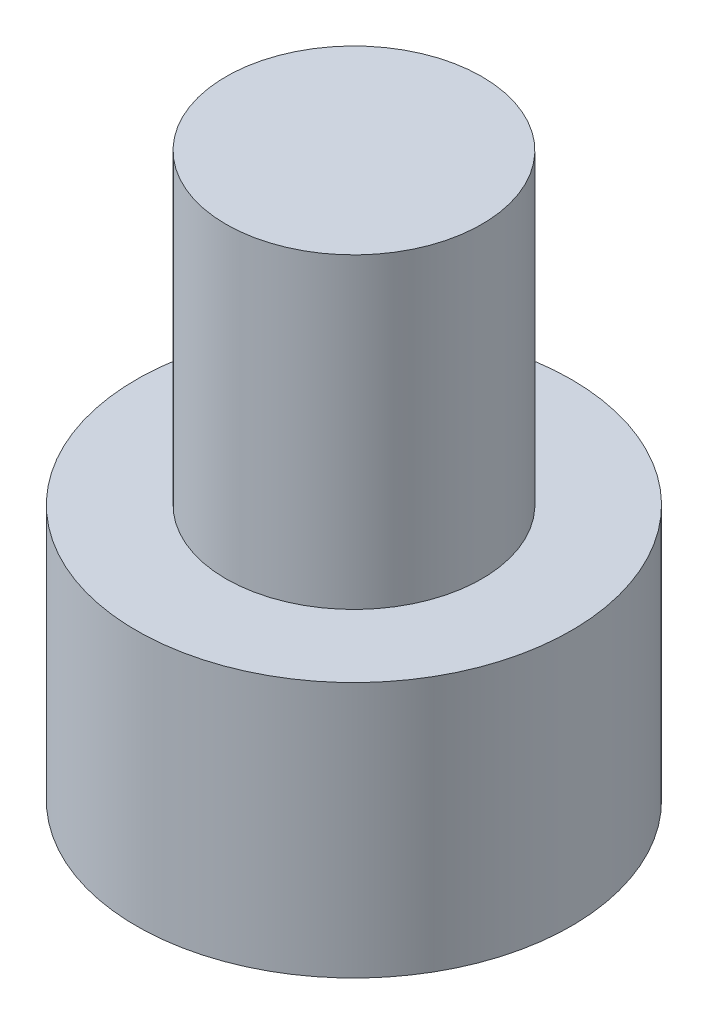
ISO-10303-21;
HEADER;
FILE_DESCRIPTION(('STEP AP214'),'2;1');
FILE_NAME('part.step','',(''),(''),'','','');
FILE_SCHEMA(('AUTOMOTIVE_DESIGN { 1 0 10303 214 1 1 1 1 }'));
ENDSEC;
DATA;
#1=APPLICATION_CONTEXT('core data for automotive mechanical design processes');
#2=APPLICATION_PROTOCOL_DEFINITION('international standard','automotive_design',2000,#1);
#3=PRODUCT_CONTEXT('',#1,'mechanical');
#4=PRODUCT('Part','Part','',(#3));
#5=PRODUCT_RELATED_PRODUCT_CATEGORY('part','',(#4));
#6=PRODUCT_DEFINITION_FORMATION('','',#4);
#7=PRODUCT_DEFINITION_CONTEXT('part definition',#1,'design');
#8=PRODUCT_DEFINITION('design','',#6,#7);
#9=PRODUCT_DEFINITION_SHAPE('','',#8);
#10=(LENGTH_UNIT() NAMED_UNIT(*) SI_UNIT(.MILLI.,.METRE.));
#11=(NAMED_UNIT(*) PLANE_ANGLE_UNIT() SI_UNIT($,.RADIAN.));
#12=(NAMED_UNIT(*) SI_UNIT($,.STERADIAN.) SOLID_ANGLE_UNIT());
#13=UNCERTAINTY_MEASURE_WITH_UNIT(LENGTH_MEASURE(1.E-05),#10,'distance_accuracy_value','');
#14=(GEOMETRIC_REPRESENTATION_CONTEXT(3) GLOBAL_UNCERTAINTY_ASSIGNED_CONTEXT((#13)) GLOBAL_UNIT_ASSIGNED_CONTEXT((#10,
#11,#12)) REPRESENTATION_CONTEXT('',''));
#15=CARTESIAN_POINT('',(0.,0.,0.));
#16=DIRECTION('',(0.,0.,1.));
#17=DIRECTION('',(1.,0.,0.));
#18=AXIS2_PLACEMENT_3D('',#15,#16,#17);
#19=CARTESIAN_POINT('',(0.,6.,0.));
#20=DIRECTION('',(0.,-1.,0.));
#21=DIRECTION('',(0.,0.,-1.));
#22=AXIS2_PLACEMENT_3D('',#19,#20,#21);
#23=CYLINDRICAL_SURFACE('',#22,2.5);
#24=CARTESIAN_POINT('',(0.,6.,0.));
#25=DIRECTION('',(0.,1.,0.));
#26=DIRECTION('',(0.,0.,1.));
#27=AXIS2_PLACEMENT_3D('',#24,#25,#26);
#28=CIRCLE('',#27,2.5);
#29=CARTESIAN_POINT('',(0.,6.,2.5));
#30=VERTEX_POINT('',#29);
#31=EDGE_CURVE('E11',#30,#30,#28,.T.);
#32=ORIENTED_EDGE('',*,*,#31,.F.);
#33=EDGE_LOOP('',(#32));
#34=FACE_BOUND('',#33,.T.);
#35=CARTESIAN_POINT('',(0.,0.,0.));
#36=DIRECTION('',(0.,1.,0.));
#37=DIRECTION('',(0.,0.,1.));
#38=AXIS2_PLACEMENT_3D('',#35,#36,#37);
#39=CIRCLE('',#38,2.5);
#40=CARTESIAN_POINT('',(0.,0.,2.5));
#41=VERTEX_POINT('',#40);
#42=EDGE_CURVE('E42',#41,#41,#39,.T.);
#43=ORIENTED_EDGE('',*,*,#42,.T.);
#44=EDGE_LOOP('',(#43));
#45=FACE_BOUND('',#44,.T.);
#46=ADVANCED_FACE('F39',(#34,#45),#23,.T.);
#47=CARTESIAN_POINT('',(0.,6.,0.));
#48=DIRECTION('',(0.,1.,0.));
#49=DIRECTION('',(0.,0.,1.));
#50=AXIS2_PLACEMENT_3D('',#47,#48,#49);
#51=PLANE('',#50);
#52=ORIENTED_EDGE('',*,*,#31,.T.);
#53=EDGE_LOOP('',(#52));
#54=FACE_BOUND('',#53,.T.);
#55=ADVANCED_FACE('F172',(#54),#51,.T.);
#56=CARTESIAN_POINT('',(0.,-5.,0.));
#57=DIRECTION('',(0.,1.,0.));
#58=DIRECTION('',(0.,0.,1.));
#59=AXIS2_PLACEMENT_3D('',#56,#57,#58);
#60=CYLINDRICAL_SURFACE('',#59,4.25);
#61=CARTESIAN_POINT('',(0.,-5.,0.));
#62=DIRECTION('',(0.,-1.,0.));
#63=DIRECTION('',(0.,0.,-1.));
#64=AXIS2_PLACEMENT_3D('',#61,#62,#63);
#65=CIRCLE('',#64,4.25);
#66=CARTESIAN_POINT('',(0.,-5.,-4.25));
#67=VERTEX_POINT('',#66);
#68=EDGE_CURVE('E146',#67,#67,#65,.T.);
#69=ORIENTED_EDGE('',*,*,#68,.F.);
#70=EDGE_LOOP('',(#69));
#71=FACE_BOUND('',#70,.T.);
#72=CARTESIAN_POINT('',(0.,0.,0.));
#73=DIRECTION('',(0.,-1.,0.));
#74=DIRECTION('',(0.,0.,-1.));
#75=AXIS2_PLACEMENT_3D('',#72,#73,#74);
#76=CIRCLE('',#75,4.25);
#77=CARTESIAN_POINT('',(0.,0.,-4.25));
#78=VERTEX_POINT('',#77);
#79=EDGE_CURVE('E140',#78,#78,#76,.T.);
#80=ORIENTED_EDGE('',*,*,#79,.T.);
#81=EDGE_LOOP('',(#80));
#82=FACE_BOUND('',#81,.T.);
#83=ADVANCED_FACE('F152',(#71,#82),#60,.T.);
#84=CARTESIAN_POINT('',(0.,-5.,0.));
#85=DIRECTION('',(0.,-1.,0.));
#86=DIRECTION('',(0.,0.,-1.));
#87=AXIS2_PLACEMENT_3D('',#84,#85,#86);
#88=PLANE('',#87);
#89=DIRECTION('',(0.5,0.,0.866025403784438));
#90=VECTOR('',#89,1.);
#91=CARTESIAN_POINT('',(1.15470053837925,-5.,-2.));
#92=LINE('',#91,#90);
#93=CARTESIAN_POINT('',(1.15470053837925,-5.,-2.));
#94=VERTEX_POINT('',#93);
#95=CARTESIAN_POINT('',(2.3094010767585,-5.,0.));
#96=VERTEX_POINT('',#95);
#97=EDGE_CURVE('E53',#94,#96,#92,.T.);
#98=ORIENTED_EDGE('',*,*,#97,.F.);
#99=DIRECTION('',(1.,0.,0.));
#100=VECTOR('',#99,1.);
#101=CARTESIAN_POINT('',(-1.15470053837925,-5.,-2.));
#102=LINE('',#101,#100);
#103=CARTESIAN_POINT('',(-1.15470053837925,-5.,-2.));
#104=VERTEX_POINT('',#103);
#105=EDGE_CURVE('E136',#104,#94,#102,.T.);
#106=ORIENTED_EDGE('',*,*,#105,.F.);
#107=DIRECTION('',(0.5,0.,-0.866025403784439));
#108=VECTOR('',#107,1.);
#109=CARTESIAN_POINT('',(-2.3094010767585,-5.,0.));
#110=LINE('',#109,#108);
#111=CARTESIAN_POINT('',(-2.3094010767585,-5.,0.));
#112=VERTEX_POINT('',#111);
#113=EDGE_CURVE('E134',#112,#104,#110,.T.);
#114=ORIENTED_EDGE('',*,*,#113,.F.);
#115=DIRECTION('',(-0.5,0.,-0.866025403784439));
#116=VECTOR('',#115,1.);
#117=CARTESIAN_POINT('',(-1.15470053837925,-5.,2.));
#118=LINE('',#117,#116);
#119=CARTESIAN_POINT('',(-1.15470053837925,-5.,2.));
#120=VERTEX_POINT('',#119);
#121=EDGE_CURVE('E101',#120,#112,#118,.T.);
#122=ORIENTED_EDGE('',*,*,#121,.F.);
#123=DIRECTION('',(-1.,0.,0.));
#124=VECTOR('',#123,1.);
#125=CARTESIAN_POINT('',(1.15470053837925,-5.,2.));
#126=LINE('',#125,#124);
#127=CARTESIAN_POINT('',(1.15470053837925,-5.,2.));
#128=VERTEX_POINT('',#127);
#129=EDGE_CURVE('E130',#128,#120,#126,.T.);
#130=ORIENTED_EDGE('',*,*,#129,.F.);
#131=DIRECTION('',(-0.5,0.,0.866025403784438));
#132=VECTOR('',#131,1.);
#133=CARTESIAN_POINT('',(2.3094010767585,-5.,0.));
#134=LINE('',#133,#132);
#135=EDGE_CURVE('E127',#96,#128,#134,.T.);
#136=ORIENTED_EDGE('',*,*,#135,.F.);
#137=EDGE_LOOP('',(#98,#106,#114,#122,#130,#136));
#138=FACE_BOUND('',#137,.T.);
#139=ORIENTED_EDGE('',*,*,#68,.T.);
#140=EDGE_LOOP('',(#139));
#141=FACE_BOUND('',#140,.T.);
#142=ADVANCED_FACE('F157',(#138,#141),#88,.T.);
#143=CARTESIAN_POINT('',(0.,0.,0.));
#144=DIRECTION('',(0.,-1.,0.));
#145=DIRECTION('',(0.,0.,-1.));
#146=AXIS2_PLACEMENT_3D('',#143,#144,#145);
#147=PLANE('',#146);
#148=ORIENTED_EDGE('',*,*,#42,.F.);
#149=EDGE_LOOP('',(#148));
#150=FACE_BOUND('',#149,.T.);
#151=ORIENTED_EDGE('',*,*,#79,.F.);
#152=EDGE_LOOP('',(#151));
#153=FACE_BOUND('',#152,.T.);
#154=ADVANCED_FACE('F154',(#150,#153),#147,.F.);
#155=CARTESIAN_POINT('',(1.15470053837925,-4.,-2.));
#156=DIRECTION('',(0.866025403784439,0.,-0.5));
#157=DIRECTION('',(-0.5,0.,-0.866025403784439));
#158=AXIS2_PLACEMENT_3D('',#155,#156,#157);
#159=PLANE('',#158);
#160=ORIENTED_EDGE('',*,*,#97,.T.);
#161=DIRECTION('',(0.,-1.,0.));
#162=VECTOR('',#161,1.);
#163=CARTESIAN_POINT('',(2.3094010767585,-4.,0.));
#164=LINE('',#163,#162);
#165=CARTESIAN_POINT('',(2.3094010767585,-4.,0.));
#166=VERTEX_POINT('',#165);
#167=EDGE_CURVE('E83',#166,#96,#164,.T.);
#168=ORIENTED_EDGE('',*,*,#167,.F.);
#169=DIRECTION('',(0.5,0.,0.866025403784438));
#170=VECTOR('',#169,1.);
#171=CARTESIAN_POINT('',(1.15470053837925,-4.,-2.));
#172=LINE('',#171,#170);
#173=CARTESIAN_POINT('',(1.15470053837925,-4.,-2.));
#174=VERTEX_POINT('',#173);
#175=EDGE_CURVE('E138',#174,#166,#172,.T.);
#176=ORIENTED_EDGE('',*,*,#175,.F.);
#177=DIRECTION('',(0.,-1.,0.));
#178=VECTOR('',#177,1.);
#179=CARTESIAN_POINT('',(1.15470053837925,-4.,-2.));
#180=LINE('',#179,#178);
#181=EDGE_CURVE('E61',#174,#94,#180,.T.);
#182=ORIENTED_EDGE('',*,*,#181,.T.);
#183=EDGE_LOOP('',(#160,#168,#176,#182));
#184=FACE_BOUND('',#183,.T.);
#185=ADVANCED_FACE('F156',(#184),#159,.F.);
#186=CARTESIAN_POINT('',(-1.15470053837925,-4.,-2.));
#187=DIRECTION('',(0.,0.,-1.));
#188=DIRECTION('',(-1.,0.,0.));
#189=AXIS2_PLACEMENT_3D('',#186,#187,#188);
#190=PLANE('',#189);
#191=ORIENTED_EDGE('',*,*,#105,.T.);
#192=ORIENTED_EDGE('',*,*,#181,.F.);
#193=DIRECTION('',(1.,0.,0.));
#194=VECTOR('',#193,1.);
#195=CARTESIAN_POINT('',(-1.15470053837925,-4.,-2.));
#196=LINE('',#195,#194);
#197=CARTESIAN_POINT('',(-1.15470053837925,-4.,-2.));
#198=VERTEX_POINT('',#197);
#199=EDGE_CURVE('E113',#198,#174,#196,.T.);
#200=ORIENTED_EDGE('',*,*,#199,.F.);
#201=DIRECTION('',(0.,-1.,0.));
#202=VECTOR('',#201,1.);
#203=CARTESIAN_POINT('',(-1.15470053837925,-4.,-2.));
#204=LINE('',#203,#202);
#205=EDGE_CURVE('E105',#198,#104,#204,.T.);
#206=ORIENTED_EDGE('',*,*,#205,.T.);
#207=EDGE_LOOP('',(#191,#192,#200,#206));
#208=FACE_BOUND('',#207,.T.);
#209=ADVANCED_FACE('F165',(#208),#190,.F.);
#210=CARTESIAN_POINT('',(-2.3094010767585,-4.,0.));
#211=DIRECTION('',(-0.866025403784439,0.,-0.5));
#212=DIRECTION('',(-0.5,0.,0.866025403784439));
#213=AXIS2_PLACEMENT_3D('',#210,#211,#212);
#214=PLANE('',#213);
#215=ORIENTED_EDGE('',*,*,#113,.T.);
#216=ORIENTED_EDGE('',*,*,#205,.F.);
#217=DIRECTION('',(0.5,0.,-0.866025403784439));
#218=VECTOR('',#217,1.);
#219=CARTESIAN_POINT('',(-2.3094010767585,-4.,0.));
#220=LINE('',#219,#218);
#221=CARTESIAN_POINT('',(-2.3094010767585,-4.,0.));
#222=VERTEX_POINT('',#221);
#223=EDGE_CURVE('E109',#222,#198,#220,.T.);
#224=ORIENTED_EDGE('',*,*,#223,.F.);
#225=DIRECTION('',(0.,-1.,0.));
#226=VECTOR('',#225,1.);
#227=CARTESIAN_POINT('',(-2.3094010767585,-4.,0.));
#228=LINE('',#227,#226);
#229=EDGE_CURVE('E94',#222,#112,#228,.T.);
#230=ORIENTED_EDGE('',*,*,#229,.T.);
#231=EDGE_LOOP('',(#215,#216,#224,#230));
#232=FACE_BOUND('',#231,.T.);
#233=ADVANCED_FACE('F110',(#232),#214,.F.);
#234=CARTESIAN_POINT('',(-1.15470053837925,-4.,2.));
#235=DIRECTION('',(-0.866025403784439,0.,0.5));
#236=DIRECTION('',(0.5,0.,0.866025403784439));
#237=AXIS2_PLACEMENT_3D('',#234,#235,#236);
#238=PLANE('',#237);
#239=ORIENTED_EDGE('',*,*,#121,.T.);
#240=ORIENTED_EDGE('',*,*,#229,.F.);
#241=DIRECTION('',(-0.5,0.,-0.866025403784439));
#242=VECTOR('',#241,1.);
#243=CARTESIAN_POINT('',(-1.15470053837925,-4.,2.));
#244=LINE('',#243,#242);
#245=CARTESIAN_POINT('',(-1.15470053837925,-4.,2.));
#246=VERTEX_POINT('',#245);
#247=EDGE_CURVE('E98',#246,#222,#244,.T.);
#248=ORIENTED_EDGE('',*,*,#247,.F.);
#249=DIRECTION('',(0.,-1.,0.));
#250=VECTOR('',#249,1.);
#251=CARTESIAN_POINT('',(-1.15470053837925,-4.,2.));
#252=LINE('',#251,#250);
#253=EDGE_CURVE('E106',#246,#120,#252,.T.);
#254=ORIENTED_EDGE('',*,*,#253,.T.);
#255=EDGE_LOOP('',(#239,#240,#248,#254));
#256=FACE_BOUND('',#255,.T.);
#257=ADVANCED_FACE('F96',(#256),#238,.F.);
#258=CARTESIAN_POINT('',(1.15470053837925,-4.,2.));
#259=DIRECTION('',(0.,0.,1.));
#260=DIRECTION('',(1.,0.,0.));
#261=AXIS2_PLACEMENT_3D('',#258,#259,#260);
#262=PLANE('',#261);
#263=ORIENTED_EDGE('',*,*,#129,.T.);
#264=ORIENTED_EDGE('',*,*,#253,.F.);
#265=DIRECTION('',(-1.,0.,0.));
#266=VECTOR('',#265,1.);
#267=CARTESIAN_POINT('',(1.15470053837925,-4.,2.));
#268=LINE('',#267,#266);
#269=CARTESIAN_POINT('',(1.15470053837925,-4.,2.));
#270=VERTEX_POINT('',#269);
#271=EDGE_CURVE('E119',#270,#246,#268,.T.);
#272=ORIENTED_EDGE('',*,*,#271,.F.);
#273=DIRECTION('',(0.,-1.,0.));
#274=VECTOR('',#273,1.);
#275=CARTESIAN_POINT('',(1.15470053837925,-4.,2.));
#276=LINE('',#275,#274);
#277=EDGE_CURVE('E143',#270,#128,#276,.T.);
#278=ORIENTED_EDGE('',*,*,#277,.T.);
#279=EDGE_LOOP('',(#263,#264,#272,#278));
#280=FACE_BOUND('',#279,.T.);
#281=ADVANCED_FACE('F219',(#280),#262,.F.);
#282=CARTESIAN_POINT('',(2.3094010767585,-4.,0.));
#283=DIRECTION('',(0.866025403784438,0.,0.5));
#284=DIRECTION('',(0.5,0.,-0.866025403784438));
#285=AXIS2_PLACEMENT_3D('',#282,#283,#284);
#286=PLANE('',#285);
#287=ORIENTED_EDGE('',*,*,#135,.T.);
#288=ORIENTED_EDGE('',*,*,#277,.F.);
#289=DIRECTION('',(-0.5,0.,0.866025403784438));
#290=VECTOR('',#289,1.);
#291=CARTESIAN_POINT('',(2.3094010767585,-4.,0.));
#292=LINE('',#291,#290);
#293=EDGE_CURVE('E121',#166,#270,#292,.T.);
#294=ORIENTED_EDGE('',*,*,#293,.F.);
#295=ORIENTED_EDGE('',*,*,#167,.T.);
#296=EDGE_LOOP('',(#287,#288,#294,#295));
#297=FACE_BOUND('',#296,.T.);
#298=ADVANCED_FACE('F226',(#297),#286,.F.);
#299=CARTESIAN_POINT('',(0.,-4.,0.));
#300=DIRECTION('',(0.,-1.,0.));
#301=DIRECTION('',(0.,0.,-1.));
#302=AXIS2_PLACEMENT_3D('',#299,#300,#301);
#303=PLANE('',#302);
#304=ORIENTED_EDGE('',*,*,#175,.T.);
#305=ORIENTED_EDGE('',*,*,#293,.T.);
#306=ORIENTED_EDGE('',*,*,#271,.T.);
#307=ORIENTED_EDGE('',*,*,#247,.T.);
#308=ORIENTED_EDGE('',*,*,#223,.T.);
#309=ORIENTED_EDGE('',*,*,#199,.T.);
#310=EDGE_LOOP('',(#304,#305,#306,#307,#308,#309));
#311=FACE_BOUND('',#310,.T.);
#312=ADVANCED_FACE('F116',(#311),#303,.T.);
#313=CLOSED_SHELL('',(#46,#55,#83,#142,#154,#185,#209,#233,#257,#281,#298,#312));
#314=MANIFOLD_SOLID_BREP('B2',#313);
#315=ADVANCED_BREP_SHAPE_REPRESENTATION('',(#18,#314),#14);
#316=SHAPE_DEFINITION_REPRESENTATION(#9,#315);
ENDSEC;
END-ISO-10303-21;
